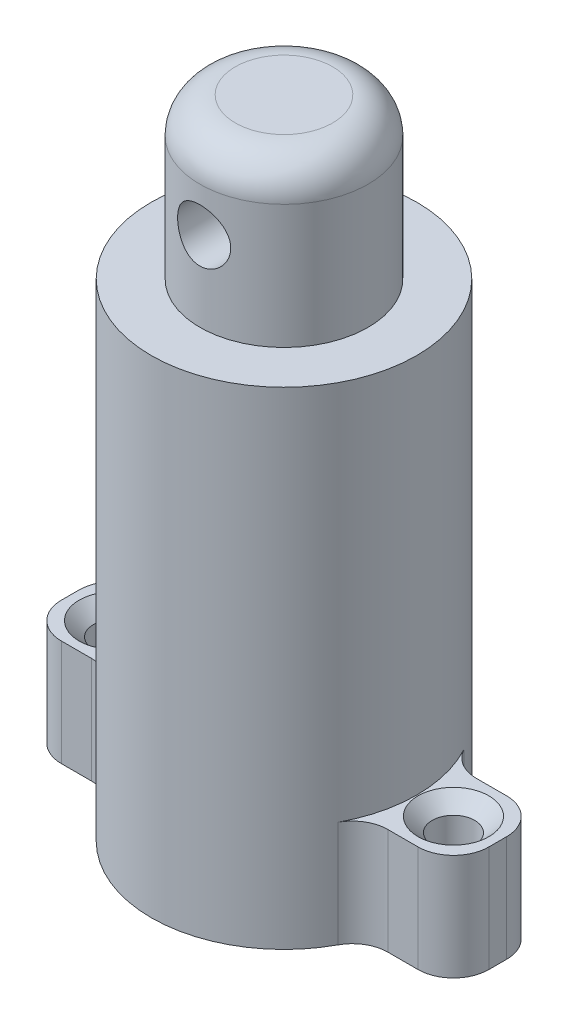
ISO-10303-21;
HEADER;
FILE_DESCRIPTION(('STEP AP214'),'2;1');
FILE_NAME('part.step','',(''),(''),'','','');
FILE_SCHEMA(('AUTOMOTIVE_DESIGN { 1 0 10303 214 1 1 1 1 }'));
ENDSEC;
DATA;
#1=APPLICATION_CONTEXT('core data for automotive mechanical design processes');
#2=APPLICATION_PROTOCOL_DEFINITION('international standard','automotive_design',2000,#1);
#3=PRODUCT_CONTEXT('',#1,'mechanical');
#4=PRODUCT('Part','Part','',(#3));
#5=PRODUCT_RELATED_PRODUCT_CATEGORY('part','',(#4));
#6=PRODUCT_DEFINITION_FORMATION('','',#4);
#7=PRODUCT_DEFINITION_CONTEXT('part definition',#1,'design');
#8=PRODUCT_DEFINITION('design','',#6,#7);
#9=PRODUCT_DEFINITION_SHAPE('','',#8);
#10=(LENGTH_UNIT() NAMED_UNIT(*) SI_UNIT(.MILLI.,.METRE.));
#11=(NAMED_UNIT(*) PLANE_ANGLE_UNIT() SI_UNIT($,.RADIAN.));
#12=(NAMED_UNIT(*) SI_UNIT($,.STERADIAN.) SOLID_ANGLE_UNIT());
#13=UNCERTAINTY_MEASURE_WITH_UNIT(LENGTH_MEASURE(1.E-05),#10,'distance_accuracy_value','');
#14=(GEOMETRIC_REPRESENTATION_CONTEXT(3) GLOBAL_UNCERTAINTY_ASSIGNED_CONTEXT((#13)) GLOBAL_UNIT_ASSIGNED_CONTEXT((#10,
#11,#12)) REPRESENTATION_CONTEXT('',''));
#15=CARTESIAN_POINT('',(0.,0.,0.));
#16=DIRECTION('',(0.,0.,1.));
#17=DIRECTION('',(1.,0.,0.));
#18=AXIS2_PLACEMENT_3D('',#15,#16,#17);
#19=CARTESIAN_POINT('',(-105.,-90.,-15.));
#20=DIRECTION('',(0.,1.,0.));
#21=DIRECTION('',(0.,0.,1.));
#22=AXIS2_PLACEMENT_3D('',#19,#20,#21);
#23=CYLINDRICAL_SURFACE('',#22,15.);
#24=CARTESIAN_POINT('',(-105.,-35.,-15.));
#25=DIRECTION('',(0.,-1.,0.));
#26=DIRECTION('',(0.,0.,-1.));
#27=AXIS2_PLACEMENT_3D('',#24,#25,#26);
#28=CIRCLE('',#27,15.);
#29=CARTESIAN_POINT('',(-105.,-35.,-30.));
#30=VERTEX_POINT('',#29);
#31=EDGE_CURVE('E219',#30,#30,#28,.T.);
#32=ORIENTED_EDGE('',*,*,#31,.T.);
#33=EDGE_LOOP('',(#32));
#34=FACE_BOUND('',#33,.T.);
#35=CARTESIAN_POINT('',(-105.,-78.,-15.));
#36=DIRECTION('',(0.,-1.,0.));
#37=DIRECTION('',(0.,0.,-1.));
#38=AXIS2_PLACEMENT_3D('',#35,#36,#37);
#39=CIRCLE('',#38,15.);
#40=CARTESIAN_POINT('',(-91.7895785284093,-78.,-22.1052631578947));
#41=VERTEX_POINT('',#40);
#42=CARTESIAN_POINT('',(-91.7895785284093,-78.,-7.89473684210526));
#43=VERTEX_POINT('',#42);
#44=EDGE_CURVE('E278',#41,#43,#39,.T.);
#45=ORIENTED_EDGE('',*,*,#44,.F.);
#46=DIRECTION('',(0.,1.,0.));
#47=VECTOR('',#46,1.);
#48=CARTESIAN_POINT('',(-91.7895785284093,-90.,-22.1052631578947));
#49=LINE('',#48,#47);
#50=CARTESIAN_POINT('',(-91.7895785284093,-90.,-22.1052631578947));
#51=VERTEX_POINT('',#50);
#52=EDGE_CURVE('E282',#41,#51,#49,.F.);
#53=ORIENTED_EDGE('',*,*,#52,.T.);
#54=CARTESIAN_POINT('',(-105.,-90.,-15.));
#55=DIRECTION('',(0.,-1.,0.));
#56=DIRECTION('',(0.,0.,-1.));
#57=AXIS2_PLACEMENT_3D('',#54,#55,#56);
#58=CIRCLE('',#57,15.);
#59=CARTESIAN_POINT('',(-118.210421471591,-90.,-22.1052631578947));
#60=VERTEX_POINT('',#59);
#61=EDGE_CURVE('E224',#60,#51,#58,.T.);
#62=ORIENTED_EDGE('',*,*,#61,.F.);
#63=DIRECTION('',(0.,1.,0.));
#64=VECTOR('',#63,1.);
#65=CARTESIAN_POINT('',(-118.210421471591,-90.,-22.1052631578947));
#66=LINE('',#65,#64);
#67=CARTESIAN_POINT('',(-118.210421471591,-78.,-22.1052631578947));
#68=VERTEX_POINT('',#67);
#69=EDGE_CURVE('E297',#60,#68,#66,.T.);
#70=ORIENTED_EDGE('',*,*,#69,.T.);
#71=CARTESIAN_POINT('',(-105.,-78.,-15.));
#72=DIRECTION('',(0.,-1.,0.));
#73=DIRECTION('',(0.,0.,-1.));
#74=AXIS2_PLACEMENT_3D('',#71,#72,#73);
#75=CIRCLE('',#74,15.);
#76=CARTESIAN_POINT('',(-118.210421471591,-78.,-7.89473684210526));
#77=VERTEX_POINT('',#76);
#78=EDGE_CURVE('E203',#77,#68,#75,.T.);
#79=ORIENTED_EDGE('',*,*,#78,.F.);
#80=DIRECTION('',(0.,1.,0.));
#81=VECTOR('',#80,1.);
#82=CARTESIAN_POINT('',(-118.210421471591,-90.,-7.89473684210526));
#83=LINE('',#82,#81);
#84=CARTESIAN_POINT('',(-118.210421471591,-90.,-7.89473684210526));
#85=VERTEX_POINT('',#84);
#86=EDGE_CURVE('E302',#77,#85,#83,.F.);
#87=ORIENTED_EDGE('',*,*,#86,.T.);
#88=CARTESIAN_POINT('',(-91.7895785284093,-90.,-7.89473684210526));
#89=VERTEX_POINT('',#88);
#90=EDGE_CURVE('E221',#89,#85,#58,.T.);
#91=ORIENTED_EDGE('',*,*,#90,.F.);
#92=DIRECTION('',(0.,1.,0.));
#93=VECTOR('',#92,1.);
#94=CARTESIAN_POINT('',(-91.7895785284093,-90.,-7.89473684210526));
#95=LINE('',#94,#93);
#96=EDGE_CURVE('E285',#89,#43,#95,.T.);
#97=ORIENTED_EDGE('',*,*,#96,.T.);
#98=EDGE_LOOP('',(#45,#53,#62,#70,#79,#87,#91,#97));
#99=FACE_BOUND('',#98,.T.);
#100=ADVANCED_FACE('F43',(#34,#99),#23,.T.);
#101=CARTESIAN_POINT('',(-105.,-90.,-15.));
#102=DIRECTION('',(0.,-1.,0.));
#103=DIRECTION('',(0.,0.,-1.));
#104=AXIS2_PLACEMENT_3D('',#101,#102,#103);
#105=PLANE('',#104);
#106=CARTESIAN_POINT('',(-124.142135623731,-90.,-15.));
#107=DIRECTION('',(0.,1.,0.));
#108=DIRECTION('',(0.,0.,1.));
#109=AXIS2_PLACEMENT_3D('',#106,#107,#108);
#110=CIRCLE('',#109,2.4);
#111=CARTESIAN_POINT('',(-124.142135623731,-90.,-12.6));
#112=VERTEX_POINT('',#111);
#113=EDGE_CURVE('E416',#112,#112,#110,.T.);
#114=ORIENTED_EDGE('',*,*,#113,.T.);
#115=EDGE_LOOP('',(#114));
#116=FACE_BOUND('',#115,.T.);
#117=CARTESIAN_POINT('',(-85.857864376269,-90.,-15.));
#118=DIRECTION('',(0.,1.,0.));
#119=DIRECTION('',(0.,0.,1.));
#120=AXIS2_PLACEMENT_3D('',#117,#118,#119);
#121=CIRCLE('',#120,2.4);
#122=CARTESIAN_POINT('',(-85.857864376269,-90.,-12.6));
#123=VERTEX_POINT('',#122);
#124=EDGE_CURVE('E404',#123,#123,#121,.T.);
#125=ORIENTED_EDGE('',*,*,#124,.T.);
#126=EDGE_LOOP('',(#125));
#127=FACE_BOUND('',#126,.T.);
#128=DIRECTION('',(-1.,0.,0.));
#129=VECTOR('',#128,1.);
#130=CARTESIAN_POINT('',(-120.,-90.,-20.));
#131=LINE('',#130,#129);
#132=CARTESIAN_POINT('',(-84.857864376269,-90.,-20.));
#133=VERTEX_POINT('',#132);
#134=CARTESIAN_POINT('',(-88.2667994693185,-90.,-20.));
#135=VERTEX_POINT('',#134);
#136=EDGE_CURVE('E174',#133,#135,#131,.T.);
#137=ORIENTED_EDGE('',*,*,#136,.F.);
#138=CARTESIAN_POINT('',(-84.857864376269,-90.,-16.));
#139=DIRECTION('',(0.,-1.,0.));
#140=DIRECTION('',(0.,0.,-1.));
#141=AXIS2_PLACEMENT_3D('',#138,#139,#140);
#142=CIRCLE('',#141,4.);
#143=CARTESIAN_POINT('',(-80.857864376269,-90.,-16.));
#144=VERTEX_POINT('',#143);
#145=EDGE_CURVE('E157',#133,#144,#142,.T.);
#146=ORIENTED_EDGE('',*,*,#145,.T.);
#147=DIRECTION('',(0.,0.,-1.));
#148=VECTOR('',#147,1.);
#149=CARTESIAN_POINT('',(-80.857864376269,-90.,0.));
#150=LINE('',#149,#148);
#151=CARTESIAN_POINT('',(-80.857864376269,-90.,-14.));
#152=VERTEX_POINT('',#151);
#153=EDGE_CURVE('E192',#152,#144,#150,.T.);
#154=ORIENTED_EDGE('',*,*,#153,.F.);
#155=CARTESIAN_POINT('',(-84.857864376269,-90.,-14.));
#156=DIRECTION('',(0.,-1.,0.));
#157=DIRECTION('',(0.,0.,-1.));
#158=AXIS2_PLACEMENT_3D('',#155,#156,#157);
#159=CIRCLE('',#158,4.);
#160=CARTESIAN_POINT('',(-84.857864376269,-90.,-10.));
#161=VERTEX_POINT('',#160);
#162=EDGE_CURVE('E178',#152,#161,#159,.T.);
#163=ORIENTED_EDGE('',*,*,#162,.T.);
#164=DIRECTION('',(1.,0.,0.));
#165=VECTOR('',#164,1.);
#166=CARTESIAN_POINT('',(-120.,-90.,-10.));
#167=LINE('',#166,#165);
#168=CARTESIAN_POINT('',(-88.2667994693185,-90.,-10.));
#169=VERTEX_POINT('',#168);
#170=EDGE_CURVE('E186',#169,#161,#167,.T.);
#171=ORIENTED_EDGE('',*,*,#170,.F.);
#172=CARTESIAN_POINT('',(-88.2667994693185,-90.,-6.));
#173=DIRECTION('',(0.,-1.,0.));
#174=DIRECTION('',(0.,0.,-1.));
#175=AXIS2_PLACEMENT_3D('',#172,#173,#174);
#176=CIRCLE('',#175,4.);
#177=EDGE_CURVE('E51',#169,#89,#176,.F.);
#178=ORIENTED_EDGE('',*,*,#177,.T.);
#179=ORIENTED_EDGE('',*,*,#90,.T.);
#180=CARTESIAN_POINT('',(-121.733200530682,-90.,-6.));
#181=DIRECTION('',(0.,-1.,0.));
#182=DIRECTION('',(0.,0.,-1.));
#183=AXIS2_PLACEMENT_3D('',#180,#181,#182);
#184=CIRCLE('',#183,4.);
#185=CARTESIAN_POINT('',(-121.733200530682,-90.,-10.));
#186=VERTEX_POINT('',#185);
#187=EDGE_CURVE('E329',#85,#186,#184,.F.);
#188=ORIENTED_EDGE('',*,*,#187,.T.);
#189=DIRECTION('',(-1.,0.,0.));
#190=VECTOR('',#189,1.);
#191=CARTESIAN_POINT('',(-120.,-90.,-10.));
#192=LINE('',#191,#190);
#193=CARTESIAN_POINT('',(-125.142135623731,-90.,-10.));
#194=VERTEX_POINT('',#193);
#195=EDGE_CURVE('E200',#186,#194,#192,.T.);
#196=ORIENTED_EDGE('',*,*,#195,.T.);
#197=CARTESIAN_POINT('',(-125.142135623731,-90.,-14.));
#198=DIRECTION('',(0.,-1.,0.));
#199=DIRECTION('',(0.,0.,-1.));
#200=AXIS2_PLACEMENT_3D('',#197,#198,#199);
#201=CIRCLE('',#200,4.);
#202=CARTESIAN_POINT('',(-129.142135623731,-90.,-14.));
#203=VERTEX_POINT('',#202);
#204=EDGE_CURVE('E348',#194,#203,#201,.T.);
#205=ORIENTED_EDGE('',*,*,#204,.T.);
#206=DIRECTION('',(0.,0.,-1.));
#207=VECTOR('',#206,1.);
#208=CARTESIAN_POINT('',(-129.142135623731,-90.,0.));
#209=LINE('',#208,#207);
#210=CARTESIAN_POINT('',(-129.142135623731,-90.,-16.));
#211=VERTEX_POINT('',#210);
#212=EDGE_CURVE('E208',#203,#211,#209,.T.);
#213=ORIENTED_EDGE('',*,*,#212,.T.);
#214=CARTESIAN_POINT('',(-125.142135623731,-90.,-16.));
#215=DIRECTION('',(0.,-1.,0.));
#216=DIRECTION('',(0.,0.,-1.));
#217=AXIS2_PLACEMENT_3D('',#214,#215,#216);
#218=CIRCLE('',#217,4.);
#219=CARTESIAN_POINT('',(-125.142135623731,-90.,-20.));
#220=VERTEX_POINT('',#219);
#221=EDGE_CURVE('E168',#211,#220,#218,.T.);
#222=ORIENTED_EDGE('',*,*,#221,.T.);
#223=DIRECTION('',(1.,0.,0.));
#224=VECTOR('',#223,1.);
#225=CARTESIAN_POINT('',(-120.,-90.,-20.));
#226=LINE('',#225,#224);
#227=CARTESIAN_POINT('',(-121.733200530682,-90.,-20.));
#228=VERTEX_POINT('',#227);
#229=EDGE_CURVE('E211',#220,#228,#226,.T.);
#230=ORIENTED_EDGE('',*,*,#229,.T.);
#231=CARTESIAN_POINT('',(-121.733200530682,-90.,-24.));
#232=DIRECTION('',(0.,-1.,0.));
#233=DIRECTION('',(0.,0.,-1.));
#234=AXIS2_PLACEMENT_3D('',#231,#232,#233);
#235=CIRCLE('',#234,4.);
#236=EDGE_CURVE('E293',#228,#60,#235,.F.);
#237=ORIENTED_EDGE('',*,*,#236,.T.);
#238=ORIENTED_EDGE('',*,*,#61,.T.);
#239=CARTESIAN_POINT('',(-88.2667994693185,-90.,-24.));
#240=DIRECTION('',(0.,-1.,0.));
#241=DIRECTION('',(0.,0.,-1.));
#242=AXIS2_PLACEMENT_3D('',#239,#240,#241);
#243=CIRCLE('',#242,4.);
#244=EDGE_CURVE('E184',#51,#135,#243,.F.);
#245=ORIENTED_EDGE('',*,*,#244,.T.);
#246=EDGE_LOOP('',(#137,#146,#154,#163,#171,#178,#179,#188,#196,#205,#213,#222,#230,#237,#238,#245));
#247=FACE_BOUND('',#246,.T.);
#248=CARTESIAN_POINT('',(-105.,-90.,-15.));
#249=DIRECTION('',(0.,-1.,0.));
#250=DIRECTION('',(0.,0.,-1.));
#251=AXIS2_PLACEMENT_3D('',#248,#249,#250);
#252=CIRCLE('',#251,10.);
#253=CARTESIAN_POINT('',(-105.,-90.,-25.));
#254=VERTEX_POINT('',#253);
#255=EDGE_CURVE('E216',#254,#254,#252,.T.);
#256=ORIENTED_EDGE('',*,*,#255,.F.);
#257=EDGE_LOOP('',(#256));
#258=FACE_BOUND('',#257,.T.);
#259=ADVANCED_FACE('F181',(#116,#127,#247,#258),#105,.T.);
#260=CARTESIAN_POINT('',(-105.,-35.,-15.));
#261=DIRECTION('',(0.,-1.,0.));
#262=DIRECTION('',(0.,0.,-1.));
#263=AXIS2_PLACEMENT_3D('',#260,#261,#262);
#264=PLANE('',#263);
#265=CARTESIAN_POINT('',(-105.,-35.,-15.));
#266=DIRECTION('',(0.,-1.,0.));
#267=DIRECTION('',(0.,0.,-1.));
#268=AXIS2_PLACEMENT_3D('',#265,#266,#267);
#269=CIRCLE('',#268,9.5);
#270=CARTESIAN_POINT('',(-105.,-35.,-24.5));
#271=VERTEX_POINT('',#270);
#272=EDGE_CURVE('E227',#271,#271,#269,.F.);
#273=ORIENTED_EDGE('',*,*,#272,.F.);
#274=EDGE_LOOP('',(#273));
#275=FACE_BOUND('',#274,.T.);
#276=ORIENTED_EDGE('',*,*,#31,.F.);
#277=EDGE_LOOP('',(#276));
#278=FACE_BOUND('',#277,.T.);
#279=ADVANCED_FACE('F263',(#275,#278),#264,.F.);
#280=CARTESIAN_POINT('',(-105.,-90.,-15.));
#281=DIRECTION('',(0.,1.,0.));
#282=DIRECTION('',(0.,0.,1.));
#283=AXIS2_PLACEMENT_3D('',#280,#281,#282);
#284=CYLINDRICAL_SURFACE('',#283,10.);
#285=CARTESIAN_POINT('',(-105.,-55.,-15.));
#286=DIRECTION('',(0.,1.,0.));
#287=DIRECTION('',(0.,0.,1.));
#288=AXIS2_PLACEMENT_3D('',#285,#286,#287);
#289=CIRCLE('',#288,10.);
#290=CARTESIAN_POINT('',(-105.,-55.,-5.));
#291=VERTEX_POINT('',#290);
#292=EDGE_CURVE('E352',#291,#291,#289,.T.);
#293=ORIENTED_EDGE('',*,*,#292,.T.);
#294=EDGE_LOOP('',(#293));
#295=FACE_BOUND('',#294,.T.);
#296=ORIENTED_EDGE('',*,*,#255,.T.);
#297=EDGE_LOOP('',(#296));
#298=FACE_BOUND('',#297,.T.);
#299=ADVANCED_FACE('F260',(#295,#298),#284,.F.);
#300=CARTESIAN_POINT('',(-105.,-17.,-15.));
#301=DIRECTION('',(0.,-1.,0.));
#302=DIRECTION('',(0.,0.,-1.));
#303=AXIS2_PLACEMENT_3D('',#300,#301,#302);
#304=CYLINDRICAL_SURFACE('',#303,9.5);
#305=CARTESIAN_POINT('',(-105.,-21.,-15.));
#306=DIRECTION('',(0.,-1.,0.));
#307=DIRECTION('',(0.,0.,-1.));
#308=AXIS2_PLACEMENT_3D('',#305,#306,#307);
#309=CIRCLE('',#308,9.5);
#310=CARTESIAN_POINT('',(-105.,-21.,-24.5));
#311=VERTEX_POINT('',#310);
#312=EDGE_CURVE('E355',#311,#311,#309,.T.);
#313=ORIENTED_EDGE('',*,*,#312,.T.);
#314=EDGE_LOOP('',(#313));
#315=FACE_BOUND('',#314,.T.);
#316=CARTESIAN_POINT('',(-105.,-23.,-24.5));
#317=CARTESIAN_POINT('',(-105.164167089463,-23.0000008079942,-24.4999993580923));
#318=CARTESIAN_POINT('',(-105.328342993004,-23.0135197389892,-24.4957045787345));
#319=CARTESIAN_POINT('',(-105.651888233263,-23.0670928984464,-24.4789929618289));
#320=CARTESIAN_POINT('',(-105.811256566918,-23.1071526249545,-24.4665744414181));
#321=CARTESIAN_POINT('',(-106.120474539009,-23.212317912368,-24.4349708637405));
#322=CARTESIAN_POINT('',(-106.270338668182,-23.2773842222139,-24.4157964146812));
#323=CARTESIAN_POINT('',(-106.557029158414,-23.4305470728574,-24.3726572519913));
#324=CARTESIAN_POINT('',(-106.693853376786,-23.5186473896769,-24.3486917531037));
#325=CARTESIAN_POINT('',(-106.954886157509,-23.7182946748529,-24.2976675332429));
#326=CARTESIAN_POINT('',(-107.078626931778,-23.8304356974736,-24.2705403669451));
#327=CARTESIAN_POINT('',(-107.305894852278,-24.0737165602455,-24.2166435380355));
#328=CARTESIAN_POINT('',(-107.4094181339,-24.2048600244188,-24.1898739446838));
#329=CARTESIAN_POINT('',(-107.595869337072,-24.4864975642318,-24.1389859370637));
#330=CARTESIAN_POINT('',(-107.678209240383,-24.6373976068883,-24.1149518397918));
#331=CARTESIAN_POINT('',(-107.816147786545,-24.9517849235525,-24.0732872417104));
#332=CARTESIAN_POINT('',(-107.871753643356,-25.1152687880907,-24.0556550137243));
#333=CARTESIAN_POINT('',(-107.952927282126,-25.4448978047389,-24.0295072122738));
#334=CARTESIAN_POINT('',(-107.979364205487,-25.6108074688176,-24.020728562665));
#335=CARTESIAN_POINT('',(-108.00416514792,-25.9449217964397,-24.0125012220487));
#336=CARTESIAN_POINT('',(-108.002536812104,-26.1131258225131,-24.0130499902065));
#337=CARTESIAN_POINT('',(-107.971932476094,-26.4398310376778,-24.0231835227404));
#338=CARTESIAN_POINT('',(-107.944065762482,-26.5984494324817,-24.0324017479326));
#339=CARTESIAN_POINT('',(-107.863575960112,-26.9086330548852,-24.0582394148415));
#340=CARTESIAN_POINT('',(-107.81095018946,-27.0601975164501,-24.0748596583322));
#341=CARTESIAN_POINT('',(-107.681661681692,-27.3545945357513,-24.1139065191807));
#342=CARTESIAN_POINT('',(-107.604653677163,-27.4972640463096,-24.1364156779989));
#343=CARTESIAN_POINT('',(-107.429026433832,-27.7680176486991,-24.1846668373259));
#344=CARTESIAN_POINT('',(-107.330401481839,-27.896097871069,-24.2104096917062));
#345=CARTESIAN_POINT('',(-107.108914435261,-28.140302722997,-24.2636937640577));
#346=CARTESIAN_POINT('',(-106.985137923183,-28.2555934581482,-24.2912629180017));
#347=CARTESIAN_POINT('',(-106.719665067862,-28.4639864805402,-24.3440378521759));
#348=CARTESIAN_POINT('',(-106.577967341579,-28.5570870536888,-24.3692434497406));
#349=CARTESIAN_POINT('',(-106.279042488608,-28.7190380889495,-24.4147256677174));
#350=CARTESIAN_POINT('',(-106.121698806459,-28.7876858920488,-24.4349606838189));
#351=CARTESIAN_POINT('',(-105.79690854605,-28.8972895556039,-24.4679212621274));
#352=CARTESIAN_POINT('',(-105.629465120717,-28.9382540099795,-24.4806491546628));
#353=CARTESIAN_POINT('',(-105.296303884002,-28.9898989182783,-24.4967847077904));
#354=CARTESIAN_POINT('',(-105.130777575906,-29.0017079316047,-24.5005395079635));
#355=CARTESIAN_POINT('',(-104.800088621039,-28.9978937651673,-24.4993347158578));
#356=CARTESIAN_POINT('',(-104.634925923591,-28.982274687076,-24.4943764265584));
#357=CARTESIAN_POINT('',(-104.314030787096,-28.9249518202319,-24.4765308692281));
#358=CARTESIAN_POINT('',(-104.158165293439,-28.8839228174412,-24.4638488528251));
#359=CARTESIAN_POINT('',(-103.855576856497,-28.7777712537272,-24.4320443454722));
#360=CARTESIAN_POINT('',(-103.708855051928,-28.7126456989056,-24.4129210542468));
#361=CARTESIAN_POINT('',(-103.424687237553,-28.5583538198726,-24.3696089503132));
#362=CARTESIAN_POINT('',(-103.287559802009,-28.4686334858539,-24.3453066989661));
#363=CARTESIAN_POINT('',(-103.029930203491,-28.2683613577479,-24.2944121872772));
#364=CARTESIAN_POINT('',(-102.909432655685,-28.1578038009185,-24.2678192945428));
#365=CARTESIAN_POINT('',(-102.683413244201,-27.9136868065147,-24.2139829863384));
#366=CARTESIAN_POINT('',(-102.578695992651,-27.7793768788571,-24.186756871098));
#367=CARTESIAN_POINT('',(-102.393209866726,-27.4944999229132,-24.1358594627064));
#368=CARTESIAN_POINT('',(-102.312440688919,-27.3439331006408,-24.1121881245168));
#369=CARTESIAN_POINT('',(-102.177629024826,-27.0310761022387,-24.0713392581632));
#370=CARTESIAN_POINT('',(-102.12348960594,-26.8688309461515,-24.0541382326222));
#371=CARTESIAN_POINT('',(-102.043500558192,-26.5368703997547,-24.0283393693878));
#372=CARTESIAN_POINT('',(-102.017639868443,-26.3671579572238,-24.0197381680889));
#373=CARTESIAN_POINT('',(-101.995747587885,-26.0335061481396,-24.0124683357529));
#374=CARTESIAN_POINT('',(-101.998393718307,-25.8696620800031,-24.0133593876891));
#375=CARTESIAN_POINT('',(-102.030238336098,-25.5448766842275,-24.0239010711208));
#376=CARTESIAN_POINT('',(-102.059435535222,-25.3839352161418,-24.0335512776259));
#377=CARTESIAN_POINT('',(-102.142660201421,-25.071943058435,-24.0602130487632));
#378=CARTESIAN_POINT('',(-102.196301653754,-24.9207788544233,-24.0771099408374));
#379=CARTESIAN_POINT('',(-102.326586993687,-24.6294760084224,-24.1163298449927));
#380=CARTESIAN_POINT('',(-102.403235630656,-24.4893396504551,-24.1386539772368));
#381=CARTESIAN_POINT('',(-102.580929197391,-24.218026509405,-24.1873223558432));
#382=CARTESIAN_POINT('',(-102.682824307421,-24.0874289834632,-24.2137913167149));
#383=CARTESIAN_POINT('',(-102.906631518692,-23.8447583247386,-24.2672016241294));
#384=CARTESIAN_POINT('',(-103.028549019328,-23.7326902051457,-24.294143096338));
#385=CARTESIAN_POINT('',(-103.293867347152,-23.5264861513898,-24.3465488605791));
#386=CARTESIAN_POINT('',(-103.43785235297,-23.4330792185407,-24.3719331087474));
#387=CARTESIAN_POINT('',(-103.740281054314,-23.271916631258,-24.4173475848601));
#388=CARTESIAN_POINT('',(-103.898719336056,-23.2041514207308,-24.4373798065647));
#389=CARTESIAN_POINT('',(-104.212728170044,-23.1008024617936,-24.468532861615));
#390=CARTESIAN_POINT('',(-104.367549733627,-23.0631122408288,-24.4802292102187));
#391=CARTESIAN_POINT('',(-104.681578728099,-23.0127132746711,-24.4959622761552));
#392=CARTESIAN_POINT('',(-104.840785218888,-22.99999921638,-24.5000006225437));
#393=CARTESIAN_POINT('',(-105.,-23.,-24.5));
#394=B_SPLINE_CURVE_WITH_KNOTS('',3,(#316,#317,#318,#319,#320,#321,#322,#323,#324,#325,#326,
#327,#328,#329,#330,#331,#332,#333,#334,#335,#336,#337,#338,#339,#340,#341,#342,#343,#344,#345,
#346,#347,#348,#349,#350,#351,#352,#353,#354,#355,#356,#357,#358,#359,#360,#361,#362,#363,#364,
#365,#366,#367,#368,#369,#370,#371,#372,#373,#374,#375,#376,#377,#378,#379,#380,#381,#382,#383,
#384,#385,#386,#387,#388,#389,#390,#391,#392,#393),.UNSPECIFIED.,.T.,.F.,(4,2,2,2,2,2,2,2,2,2,2,
2,2,2,2,2,2,2,2,2,2,2,2,2,2,2,2,2,2,2,2,2,2,2,2,2,2,2,4),(0.,0.491915941705377,
0.983933817902436,1.47518254201798,1.96651184830559,2.47177433217167,2.97713330355078,
3.49529138086523,4.01330955891889,4.51543663249027,5.0174269263623,5.49910423633608,
5.98083373346491,6.46971527661727,6.95872618352225,7.47049694812959,7.98230723196765,
8.49826565849843,9.01406383907481,9.50955937080913,10.0049808110835,10.4877787812059,
10.9706367571643,11.4654198237929,11.9603399289468,12.4753133176054,12.9902801810781,
13.5033584262729,14.0162359151874,14.5054301927743,14.9946007361353,15.4763007218674,
15.9581002132873,16.4590917155025,16.9602185415511,17.4781824310863,17.9959530965539,
18.4731312898966,18.9502079636715),.UNSPECIFIED.);
#395=CARTESIAN_POINT('',(-105.,-23.,-24.5));
#396=VERTEX_POINT('',#395);
#397=EDGE_CURVE('E220',#396,#396,#394,.T.);
#398=ORIENTED_EDGE('',*,*,#397,.T.);
#399=EDGE_LOOP('',(#398));
#400=FACE_BOUND('',#399,.T.);
#401=CARTESIAN_POINT('',(-108.,-26.,-5.98612181134002));
#402=CARTESIAN_POINT('',(-107.99999916009,-25.8360634346477,-5.98612100969062));
#403=CARTESIAN_POINT('',(-107.986516804634,-25.6721180325505,-5.9816005825183));
#404=CARTESIAN_POINT('',(-107.933102097742,-25.3490499810011,-5.96408934924379));
#405=CARTESIAN_POINT('',(-107.893163042625,-25.1899285645546,-5.95109639635945));
#406=CARTESIAN_POINT('',(-107.788350167052,-24.8812355943009,-5.91825530425475));
#407=CARTESIAN_POINT('',(-107.723521190748,-24.731647426377,-5.89841950027868));
#408=CARTESIAN_POINT('',(-107.570918933045,-24.4454278879907,-5.85414496011506));
#409=CARTESIAN_POINT('',(-107.483141436702,-24.3087989040241,-5.82970537858473));
#410=CARTESIAN_POINT('',(-107.283835699426,-24.0475826570959,-5.77801532395759));
#411=CARTESIAN_POINT('',(-107.171640609875,-23.9235168725282,-5.75070015534826));
#412=CARTESIAN_POINT('',(-106.928110843954,-23.695611294353,-5.69688657813697));
#413=CARTESIAN_POINT('',(-106.796773440468,-23.5917743875927,-5.67038828656444));
#414=CARTESIAN_POINT('',(-106.514929673403,-23.4049629877492,-5.62045268168193));
#415=CARTESIAN_POINT('',(-106.364050002112,-23.3225269765933,-5.59710040908694));
#416=CARTESIAN_POINT('',(-106.049704134847,-23.1844054855509,-5.55684453967551));
#417=CARTESIAN_POINT('',(-105.886240974442,-23.1287135773877,-5.53993939341363));
#418=CARTESIAN_POINT('',(-105.556829551654,-23.0474065377978,-5.51494050299839));
#419=CARTESIAN_POINT('',(-105.391121502287,-23.0208997970879,-5.50658613384737));
#420=CARTESIAN_POINT('',(-105.057413457221,-22.9958889918049,-5.49870890919401));
#421=CARTESIAN_POINT('',(-104.889414002261,-22.9973784309799,-5.49918400489659));
#422=CARTESIAN_POINT('',(-104.562172761296,-23.0277343991118,-5.50873145299671));
#423=CARTESIAN_POINT('',(-104.40283101004,-23.0556340994337,-5.51750018201622));
#424=CARTESIAN_POINT('',(-104.09121937649,-23.1364303153009,-5.54227501027744));
#425=CARTESIAN_POINT('',(-103.938949959328,-23.1893284723902,-5.55828158479518));
#426=CARTESIAN_POINT('',(-103.64359269465,-23.3192323637695,-5.59613792880366));
#427=CARTESIAN_POINT('',(-103.500641973409,-23.3965286553513,-5.61805763467375));
#428=CARTESIAN_POINT('',(-103.229441795242,-23.572800629175,-5.66543500265061));
#429=CARTESIAN_POINT('',(-103.101196128531,-23.6717818816471,-5.6908935731726));
#430=CARTESIAN_POINT('',(-102.857283251183,-23.8935639324672,-5.74392020548476));
#431=CARTESIAN_POINT('',(-102.742382560509,-24.017198468095,-5.77153193542966));
#432=CARTESIAN_POINT('',(-102.5347139789,-24.2822363179685,-5.82482215104662));
#433=CARTESIAN_POINT('',(-102.441948811138,-24.4236418151832,-5.85050039859065));
#434=CARTESIAN_POINT('',(-102.280267226175,-24.7224135436321,-5.89723951920617));
#435=CARTESIAN_POINT('',(-102.211640727276,-24.8799462771047,-5.91824321700665));
#436=CARTESIAN_POINT('',(-102.102133151021,-25.205156203299,-5.9525860224881));
#437=CARTESIAN_POINT('',(-102.061241853934,-25.3728296345934,-5.96592795306197));
#438=CARTESIAN_POINT('',(-102.009856760402,-25.7062047206758,-5.98280812376431));
#439=CARTESIAN_POINT('',(-101.998186894225,-25.871706007365,-5.98672540771475));
#440=CARTESIAN_POINT('',(-102.002269720694,-26.2023154319255,-5.9853662507911));
#441=CARTESIAN_POINT('',(-102.018018065587,-26.3674236279726,-5.98009126755114));
#442=CARTESIAN_POINT('',(-102.075438308034,-26.6874533757969,-5.96131673350252));
#443=CARTESIAN_POINT('',(-102.116325616174,-26.8425318413344,-5.94806634963258));
#444=CARTESIAN_POINT('',(-102.221938866273,-27.1436078649571,-5.91509955632878));
#445=CARTESIAN_POINT('',(-102.286668750247,-27.2896039167323,-5.89538207771642));
#446=CARTESIAN_POINT('',(-102.440282517315,-27.5730834074432,-5.85098921666342));
#447=CARTESIAN_POINT('',(-102.529815715712,-27.7101944565478,-5.82618602298235));
#448=CARTESIAN_POINT('',(-102.72974002634,-27.9678740915171,-5.77467844762972));
#449=CARTESIAN_POINT('',(-102.840136670721,-28.0884382751468,-5.74797356287908));
#450=CARTESIAN_POINT('',(-103.084227924938,-28.314883553216,-5.69429973089647));
#451=CARTESIAN_POINT('',(-103.21871266978,-28.4199239657768,-5.66736770675384));
#452=CARTESIAN_POINT('',(-103.504053278739,-28.6059826163827,-5.61740488406344));
#453=CARTESIAN_POINT('',(-103.65490841364,-28.687001923841,-5.59437391186143));
#454=CARTESIAN_POINT('',(-103.967801423098,-28.8219447250633,-5.55493662583654));
#455=CARTESIAN_POINT('',(-104.129749437134,-28.876062063569,-5.53848309128134));
#456=CARTESIAN_POINT('',(-104.461061201016,-28.956106088686,-5.5138472531998));
#457=CARTESIAN_POINT('',(-104.630422557995,-28.9820418029305,-5.50566230099488));
#458=CARTESIAN_POINT('',(-104.964022702824,-29.0042406065317,-5.4986651365482));
#459=CARTESIAN_POINT('',(-105.128173672308,-29.00171680543,-5.49946972408845));
#460=CARTESIAN_POINT('',(-105.453606441926,-28.9700109093279,-5.50943941994109));
#461=CARTESIAN_POINT('',(-105.614888435162,-28.9408306154566,-5.51860396338689));
#462=CARTESIAN_POINT('',(-105.927939673529,-28.8574178801142,-5.54413950591636));
#463=CARTESIAN_POINT('',(-106.079805345549,-28.8035161345048,-5.56041524732704));
#464=CARTESIAN_POINT('',(-106.372408690366,-28.6724902868108,-5.59849544407887));
#465=CARTESIAN_POINT('',(-106.513144430226,-28.5953621621283,-5.62030085700552));
#466=CARTESIAN_POINT('',(-106.784764313428,-28.417005361053,-5.66810325274972));
#467=CARTESIAN_POINT('',(-106.915142772534,-28.3150386571887,-5.69421865611733));
#468=CARTESIAN_POINT('',(-107.157340195279,-28.0911935750031,-5.74736324062632));
#469=CARTESIAN_POINT('',(-107.269153528506,-27.9693091782212,-5.77439269599975));
#470=CARTESIAN_POINT('',(-107.474892247443,-27.7041171144557,-5.82739967867121));
#471=CARTESIAN_POINT('',(-107.568079116472,-27.5602214034839,-5.85331007300479));
#472=CARTESIAN_POINT('',(-107.728851216987,-27.2580278865587,-5.89997709807926));
#473=CARTESIAN_POINT('',(-107.79644626098,-27.09973562951,-5.92073570308319));
#474=CARTESIAN_POINT('',(-107.899498010071,-26.7861070948575,-5.95314400234149));
#475=CARTESIAN_POINT('',(-107.937073641396,-26.6315271082842,-5.96538425082366));
#476=CARTESIAN_POINT('',(-107.98732180654,-26.3179667482948,-5.98187250515971));
#477=CARTESIAN_POINT('',(-108.000000814554,-26.1589875297766,-5.98612258878865));
#478=CARTESIAN_POINT('',(-108.,-26.,-5.98612181134002));
#479=B_SPLINE_CURVE_WITH_KNOTS('',3,(#401,#402,#403,#404,#405,#406,#407,#408,#409,#410,#411,
#412,#413,#414,#415,#416,#417,#418,#419,#420,#421,#422,#423,#424,#425,#426,#427,#428,#429,#430,
#431,#432,#433,#434,#435,#436,#437,#438,#439,#440,#441,#442,#443,#444,#445,#446,#447,#448,#449,
#450,#451,#452,#453,#454,#455,#456,#457,#458,#459,#460,#461,#462,#463,#464,#465,#466,#467,#468,
#469,#470,#471,#472,#473,#474,#475,#476,#477,#478),.UNSPECIFIED.,.T.,.F.,(4,2,2,2,2,2,2,2,2,2,2,
2,2,2,2,2,2,2,2,2,2,2,2,2,2,2,2,2,2,2,2,2,2,2,2,2,2,2,4),(0.,0.491222181158546,
0.982568877371571,1.47303443769153,1.96359014493515,2.46975467928505,2.97599139514678,
3.49394489794377,4.01177384180478,4.51330187161205,5.0147135279646,5.49845160025534,
5.98222144201366,6.4719848720446,6.96187425574551,7.47259002708078,7.98336859572039,
8.50008771949267,9.016616341505,9.51199573643174,10.007296585316,10.4878728285309,
10.9685285635467,11.4632008063928,11.9580044009777,12.4738149453962,12.9896025226149,
13.501617628388,14.0134686680832,14.5035871064134,14.993672430811,15.4773850040824,
15.9611814002052,16.461626540619,16.9622231793843,17.479861117622,17.9973003798423,
18.4738171219117,18.9502099326676),.UNSPECIFIED.);
#480=CARTESIAN_POINT('',(-108.,-26.,-5.98612181134002));
#481=VERTEX_POINT('',#480);
#482=EDGE_CURVE('E207',#481,#481,#479,.T.);
#483=ORIENTED_EDGE('',*,*,#482,.T.);
#484=EDGE_LOOP('',(#483));
#485=FACE_BOUND('',#484,.T.);
#486=ORIENTED_EDGE('',*,*,#272,.T.);
#487=EDGE_LOOP('',(#486));
#488=FACE_BOUND('',#487,.T.);
#489=ADVANCED_FACE('F242',(#315,#400,#485,#488),#304,.T.);
#490=CARTESIAN_POINT('',(-120.,-17.,0.));
#491=DIRECTION('',(0.,-1.,0.));
#492=DIRECTION('',(0.,0.,-1.));
#493=AXIS2_PLACEMENT_3D('',#490,#491,#492);
#494=PLANE('',#493);
#495=CARTESIAN_POINT('',(-105.,-17.,-15.));
#496=DIRECTION('',(0.,-1.,0.));
#497=DIRECTION('',(0.,0.,-1.));
#498=AXIS2_PLACEMENT_3D('',#495,#496,#497);
#499=CIRCLE('',#498,5.5);
#500=CARTESIAN_POINT('',(-105.,-17.,-20.5));
#501=VERTEX_POINT('',#500);
#502=EDGE_CURVE('E230',#501,#501,#499,.F.);
#503=ORIENTED_EDGE('',*,*,#502,.T.);
#504=EDGE_LOOP('',(#503));
#505=FACE_BOUND('',#504,.T.);
#506=ADVANCED_FACE('F252',(#505),#494,.F.);
#507=CARTESIAN_POINT('',(-105.,-26.,-30.));
#508=DIRECTION('',(0.,0.,-1.));
#509=DIRECTION('',(-1.,0.,0.));
#510=AXIS2_PLACEMENT_3D('',#507,#508,#509);
#511=CYLINDRICAL_SURFACE('',#510,2.99999999999999);
#512=ORIENTED_EDGE('',*,*,#482,.F.);
#513=EDGE_LOOP('',(#512));
#514=FACE_BOUND('',#513,.T.);
#515=ORIENTED_EDGE('',*,*,#397,.F.);
#516=EDGE_LOOP('',(#515));
#517=FACE_BOUND('',#516,.T.);
#518=ADVANCED_FACE('F246',(#514,#517),#511,.F.);
#519=CARTESIAN_POINT('',(-105.,-21.,-15.));
#520=DIRECTION('',(0.,-1.,0.));
#521=DIRECTION('',(0.,0.,-1.));
#522=AXIS2_PLACEMENT_3D('',#519,#520,#521);
#523=TOROIDAL_SURFACE('',#522,5.5,4.);
#524=ORIENTED_EDGE('',*,*,#312,.F.);
#525=EDGE_LOOP('',(#524));
#526=FACE_BOUND('',#525,.T.);
#527=ORIENTED_EDGE('',*,*,#502,.F.);
#528=EDGE_LOOP('',(#527));
#529=FACE_BOUND('',#528,.T.);
#530=ADVANCED_FACE('F251',(#526,#529),#523,.T.);
#531=CARTESIAN_POINT('',(-105.,-55.,-15.));
#532=DIRECTION('',(0.,-1.,0.));
#533=DIRECTION('',(0.,0.,-1.));
#534=AXIS2_PLACEMENT_3D('',#531,#532,#533);
#535=SPHERICAL_SURFACE('',#534,10.);
#536=ORIENTED_EDGE('',*,*,#292,.F.);
#537=EDGE_LOOP('',(#536));
#538=FACE_BOUND('',#537,.T.);
#539=ADVANCED_FACE('F361',(#538),#535,.F.);
#540=CARTESIAN_POINT('',(-129.142135623731,-78.,0.));
#541=DIRECTION('',(-1.,0.,0.));
#542=DIRECTION('',(0.,0.,1.));
#543=AXIS2_PLACEMENT_3D('',#540,#541,#542);
#544=PLANE('',#543);
#545=DIRECTION('',(0.,0.,-1.));
#546=VECTOR('',#545,1.);
#547=CARTESIAN_POINT('',(-129.142135623731,-78.,0.));
#548=LINE('',#547,#546);
#549=CARTESIAN_POINT('',(-129.142135623731,-78.,-14.));
#550=VERTEX_POINT('',#549);
#551=CARTESIAN_POINT('',(-129.142135623731,-78.,-16.));
#552=VERTEX_POINT('',#551);
#553=EDGE_CURVE('E196',#550,#552,#548,.T.);
#554=ORIENTED_EDGE('',*,*,#553,.T.);
#555=DIRECTION('',(0.,-1.,0.));
#556=VECTOR('',#555,1.);
#557=CARTESIAN_POINT('',(-129.142135623731,-78.,-16.));
#558=LINE('',#557,#556);
#559=EDGE_CURVE('E310',#552,#211,#558,.T.);
#560=ORIENTED_EDGE('',*,*,#559,.T.);
#561=ORIENTED_EDGE('',*,*,#212,.F.);
#562=DIRECTION('',(0.,-1.,0.));
#563=VECTOR('',#562,1.);
#564=CARTESIAN_POINT('',(-129.142135623731,-78.,-14.));
#565=LINE('',#564,#563);
#566=EDGE_CURVE('E308',#203,#550,#565,.F.);
#567=ORIENTED_EDGE('',*,*,#566,.T.);
#568=EDGE_LOOP('',(#554,#560,#561,#567));
#569=FACE_BOUND('',#568,.T.);
#570=ADVANCED_FACE('F254',(#569),#544,.T.);
#571=CARTESIAN_POINT('',(-120.,-78.,-10.));
#572=DIRECTION('',(0.,0.,1.));
#573=DIRECTION('',(1.,0.,0.));
#574=AXIS2_PLACEMENT_3D('',#571,#572,#573);
#575=PLANE('',#574);
#576=DIRECTION('',(-1.,0.,0.));
#577=VECTOR('',#576,1.);
#578=CARTESIAN_POINT('',(-120.,-78.,-10.));
#579=LINE('',#578,#577);
#580=CARTESIAN_POINT('',(-121.733200530682,-78.,-10.));
#581=VERTEX_POINT('',#580);
#582=CARTESIAN_POINT('',(-125.142135623731,-78.,-10.));
#583=VERTEX_POINT('',#582);
#584=EDGE_CURVE('E205',#581,#583,#579,.T.);
#585=ORIENTED_EDGE('',*,*,#584,.T.);
#586=DIRECTION('',(0.,-1.,0.));
#587=VECTOR('',#586,1.);
#588=CARTESIAN_POINT('',(-125.142135623731,-78.,-10.));
#589=LINE('',#588,#587);
#590=EDGE_CURVE('E317',#583,#194,#589,.T.);
#591=ORIENTED_EDGE('',*,*,#590,.T.);
#592=ORIENTED_EDGE('',*,*,#195,.F.);
#593=DIRECTION('',(0.,1.,0.));
#594=VECTOR('',#593,1.);
#595=CARTESIAN_POINT('',(-121.733200530682,-78.,-10.));
#596=LINE('',#595,#594);
#597=EDGE_CURVE('E65',#186,#581,#596,.T.);
#598=ORIENTED_EDGE('',*,*,#597,.T.);
#599=EDGE_LOOP('',(#585,#591,#592,#598));
#600=FACE_BOUND('',#599,.T.);
#601=ADVANCED_FACE('F443',(#600),#575,.T.);
#602=CARTESIAN_POINT('',(-120.,-78.,-20.));
#603=DIRECTION('',(0.,0.,-1.));
#604=DIRECTION('',(-1.,0.,0.));
#605=AXIS2_PLACEMENT_3D('',#602,#603,#604);
#606=PLANE('',#605);
#607=DIRECTION('',(1.,0.,0.));
#608=VECTOR('',#607,1.);
#609=CARTESIAN_POINT('',(-120.,-78.,-20.));
#610=LINE('',#609,#608);
#611=CARTESIAN_POINT('',(-125.142135623731,-78.,-20.));
#612=VERTEX_POINT('',#611);
#613=CARTESIAN_POINT('',(-121.733200530682,-78.,-20.));
#614=VERTEX_POINT('',#613);
#615=EDGE_CURVE('E199',#612,#614,#610,.T.);
#616=ORIENTED_EDGE('',*,*,#615,.T.);
#617=DIRECTION('',(0.,1.,0.));
#618=VECTOR('',#617,1.);
#619=CARTESIAN_POINT('',(-121.733200530682,-78.,-20.));
#620=LINE('',#619,#618);
#621=EDGE_CURVE('E299',#614,#228,#620,.F.);
#622=ORIENTED_EDGE('',*,*,#621,.T.);
#623=ORIENTED_EDGE('',*,*,#229,.F.);
#624=DIRECTION('',(0.,-1.,0.));
#625=VECTOR('',#624,1.);
#626=CARTESIAN_POINT('',(-125.142135623731,-78.,-20.));
#627=LINE('',#626,#625);
#628=EDGE_CURVE('E296',#220,#612,#627,.F.);
#629=ORIENTED_EDGE('',*,*,#628,.T.);
#630=EDGE_LOOP('',(#616,#622,#623,#629));
#631=FACE_BOUND('',#630,.T.);
#632=ADVANCED_FACE('F429',(#631),#606,.T.);
#633=CARTESIAN_POINT('',(-120.,-78.,0.));
#634=DIRECTION('',(0.,-1.,0.));
#635=DIRECTION('',(0.,0.,-1.));
#636=AXIS2_PLACEMENT_3D('',#633,#634,#635);
#637=PLANE('',#636);
#638=CARTESIAN_POINT('',(-124.142135623731,-78.,-15.));
#639=DIRECTION('',(0.,1.,0.));
#640=DIRECTION('',(0.,0.,1.));
#641=AXIS2_PLACEMENT_3D('',#638,#639,#640);
#642=CIRCLE('',#641,4.);
#643=CARTESIAN_POINT('',(-124.142135623731,-78.,-11.));
#644=VERTEX_POINT('',#643);
#645=EDGE_CURVE('E422',#644,#644,#642,.T.);
#646=ORIENTED_EDGE('',*,*,#645,.F.);
#647=EDGE_LOOP('',(#646));
#648=FACE_BOUND('',#647,.T.);
#649=ORIENTED_EDGE('',*,*,#615,.F.);
#650=CARTESIAN_POINT('',(-125.142135623731,-78.,-16.));
#651=DIRECTION('',(0.,-1.,0.));
#652=DIRECTION('',(0.,0.,-1.));
#653=AXIS2_PLACEMENT_3D('',#650,#651,#652);
#654=CIRCLE('',#653,4.);
#655=EDGE_CURVE('E314',#612,#552,#654,.F.);
#656=ORIENTED_EDGE('',*,*,#655,.T.);
#657=ORIENTED_EDGE('',*,*,#553,.F.);
#658=CARTESIAN_POINT('',(-125.142135623731,-78.,-14.));
#659=DIRECTION('',(0.,-1.,0.));
#660=DIRECTION('',(0.,0.,-1.));
#661=AXIS2_PLACEMENT_3D('',#658,#659,#660);
#662=CIRCLE('',#661,4.);
#663=EDGE_CURVE('E58',#550,#583,#662,.F.);
#664=ORIENTED_EDGE('',*,*,#663,.T.);
#665=ORIENTED_EDGE('',*,*,#584,.F.);
#666=CARTESIAN_POINT('',(-121.733200530682,-78.,-6.));
#667=DIRECTION('',(0.,-1.,0.));
#668=DIRECTION('',(0.,0.,-1.));
#669=AXIS2_PLACEMENT_3D('',#666,#667,#668);
#670=CIRCLE('',#669,4.);
#671=EDGE_CURVE('E331',#581,#77,#670,.T.);
#672=ORIENTED_EDGE('',*,*,#671,.T.);
#673=ORIENTED_EDGE('',*,*,#78,.T.);
#674=CARTESIAN_POINT('',(-121.733200530682,-78.,-24.));
#675=DIRECTION('',(0.,-1.,0.));
#676=DIRECTION('',(0.,0.,-1.));
#677=AXIS2_PLACEMENT_3D('',#674,#675,#676);
#678=CIRCLE('',#677,4.);
#679=EDGE_CURVE('E327',#68,#614,#678,.T.);
#680=ORIENTED_EDGE('',*,*,#679,.T.);
#681=EDGE_LOOP('',(#649,#656,#657,#664,#665,#672,#673,#680));
#682=FACE_BOUND('',#681,.T.);
#683=ADVANCED_FACE('F427',(#648,#682),#637,.F.);
#684=CARTESIAN_POINT('',(-80.857864376269,-78.,0.));
#685=DIRECTION('',(-1.,0.,0.));
#686=DIRECTION('',(0.,0.,1.));
#687=AXIS2_PLACEMENT_3D('',#684,#685,#686);
#688=PLANE('',#687);
#689=ORIENTED_EDGE('',*,*,#153,.T.);
#690=DIRECTION('',(0.,-1.,0.));
#691=VECTOR('',#690,1.);
#692=CARTESIAN_POINT('',(-80.857864376269,-78.,-16.));
#693=LINE('',#692,#691);
#694=CARTESIAN_POINT('',(-80.857864376269,-78.,-16.));
#695=VERTEX_POINT('',#694);
#696=EDGE_CURVE('E162',#144,#695,#693,.F.);
#697=ORIENTED_EDGE('',*,*,#696,.T.);
#698=DIRECTION('',(0.,0.,-1.));
#699=VECTOR('',#698,1.);
#700=CARTESIAN_POINT('',(-80.857864376269,-78.,0.));
#701=LINE('',#700,#699);
#702=CARTESIAN_POINT('',(-80.857864376269,-78.,-14.));
#703=VERTEX_POINT('',#702);
#704=EDGE_CURVE('E185',#703,#695,#701,.T.);
#705=ORIENTED_EDGE('',*,*,#704,.F.);
#706=DIRECTION('',(0.,-1.,0.));
#707=VECTOR('',#706,1.);
#708=CARTESIAN_POINT('',(-80.857864376269,-78.,-14.));
#709=LINE('',#708,#707);
#710=EDGE_CURVE('E167',#703,#152,#709,.T.);
#711=ORIENTED_EDGE('',*,*,#710,.T.);
#712=EDGE_LOOP('',(#689,#697,#705,#711));
#713=FACE_BOUND('',#712,.T.);
#714=ADVANCED_FACE('F403',(#713),#688,.F.);
#715=CARTESIAN_POINT('',(-120.,-78.,-20.));
#716=DIRECTION('',(0.,0.,1.));
#717=DIRECTION('',(1.,0.,0.));
#718=AXIS2_PLACEMENT_3D('',#715,#716,#717);
#719=PLANE('',#718);
#720=DIRECTION('',(-1.,0.,0.));
#721=VECTOR('',#720,1.);
#722=CARTESIAN_POINT('',(-120.,-78.,-20.));
#723=LINE('',#722,#721);
#724=CARTESIAN_POINT('',(-84.857864376269,-78.,-20.));
#725=VERTEX_POINT('',#724);
#726=CARTESIAN_POINT('',(-88.2667994693185,-78.,-20.));
#727=VERTEX_POINT('',#726);
#728=EDGE_CURVE('E177',#725,#727,#723,.T.);
#729=ORIENTED_EDGE('',*,*,#728,.F.);
#730=DIRECTION('',(0.,-1.,0.));
#731=VECTOR('',#730,1.);
#732=CARTESIAN_POINT('',(-84.857864376269,-78.,-20.));
#733=LINE('',#732,#731);
#734=EDGE_CURVE('E161',#725,#133,#733,.T.);
#735=ORIENTED_EDGE('',*,*,#734,.T.);
#736=ORIENTED_EDGE('',*,*,#136,.T.);
#737=DIRECTION('',(0.,-1.,0.));
#738=VECTOR('',#737,1.);
#739=CARTESIAN_POINT('',(-88.2667994693185,-78.,-20.));
#740=LINE('',#739,#738);
#741=EDGE_CURVE('E179',#135,#727,#740,.F.);
#742=ORIENTED_EDGE('',*,*,#741,.T.);
#743=EDGE_LOOP('',(#729,#735,#736,#742));
#744=FACE_BOUND('',#743,.T.);
#745=ADVANCED_FACE('F173',(#744),#719,.F.);
#746=CARTESIAN_POINT('',(-120.,-78.,-10.));
#747=DIRECTION('',(0.,0.,-1.));
#748=DIRECTION('',(-1.,0.,0.));
#749=AXIS2_PLACEMENT_3D('',#746,#747,#748);
#750=PLANE('',#749);
#751=ORIENTED_EDGE('',*,*,#170,.T.);
#752=DIRECTION('',(0.,-1.,0.));
#753=VECTOR('',#752,1.);
#754=CARTESIAN_POINT('',(-84.857864376269,-78.,-10.));
#755=LINE('',#754,#753);
#756=CARTESIAN_POINT('',(-84.857864376269,-78.,-10.));
#757=VERTEX_POINT('',#756);
#758=EDGE_CURVE('E323',#161,#757,#755,.F.);
#759=ORIENTED_EDGE('',*,*,#758,.T.);
#760=DIRECTION('',(1.,0.,0.));
#761=VECTOR('',#760,1.);
#762=CARTESIAN_POINT('',(-120.,-78.,-10.));
#763=LINE('',#762,#761);
#764=CARTESIAN_POINT('',(-88.2667994693185,-78.,-10.));
#765=VERTEX_POINT('',#764);
#766=EDGE_CURVE('E189',#765,#757,#763,.T.);
#767=ORIENTED_EDGE('',*,*,#766,.F.);
#768=DIRECTION('',(0.,-1.,0.));
#769=VECTOR('',#768,1.);
#770=CARTESIAN_POINT('',(-88.2667994693185,-90.,-10.));
#771=LINE('',#770,#769);
#772=EDGE_CURVE('E320',#765,#169,#771,.T.);
#773=ORIENTED_EDGE('',*,*,#772,.T.);
#774=EDGE_LOOP('',(#751,#759,#767,#773));
#775=FACE_BOUND('',#774,.T.);
#776=ADVANCED_FACE('F454',(#775),#750,.F.);
#777=CARTESIAN_POINT('',(-120.,-78.,0.));
#778=DIRECTION('',(0.,-1.,0.));
#779=DIRECTION('',(0.,0.,-1.));
#780=AXIS2_PLACEMENT_3D('',#777,#778,#779);
#781=PLANE('',#780);
#782=CARTESIAN_POINT('',(-85.857864376269,-78.,-15.));
#783=DIRECTION('',(0.,1.,0.));
#784=DIRECTION('',(0.,0.,1.));
#785=AXIS2_PLACEMENT_3D('',#782,#783,#784);
#786=CIRCLE('',#785,4.);
#787=CARTESIAN_POINT('',(-85.857864376269,-78.,-11.));
#788=VERTEX_POINT('',#787);
#789=EDGE_CURVE('E413',#788,#788,#786,.T.);
#790=ORIENTED_EDGE('',*,*,#789,.F.);
#791=EDGE_LOOP('',(#790));
#792=FACE_BOUND('',#791,.T.);
#793=ORIENTED_EDGE('',*,*,#704,.T.);
#794=CARTESIAN_POINT('',(-84.857864376269,-78.,-16.));
#795=DIRECTION('',(0.,-1.,0.));
#796=DIRECTION('',(0.,0.,-1.));
#797=AXIS2_PLACEMENT_3D('',#794,#795,#796);
#798=CIRCLE('',#797,4.);
#799=EDGE_CURVE('E338',#695,#725,#798,.F.);
#800=ORIENTED_EDGE('',*,*,#799,.T.);
#801=ORIENTED_EDGE('',*,*,#728,.T.);
#802=CARTESIAN_POINT('',(-88.2667994693185,-78.,-24.));
#803=DIRECTION('',(0.,-1.,0.));
#804=DIRECTION('',(0.,0.,-1.));
#805=AXIS2_PLACEMENT_3D('',#802,#803,#804);
#806=CIRCLE('',#805,4.);
#807=EDGE_CURVE('E290',#727,#41,#806,.T.);
#808=ORIENTED_EDGE('',*,*,#807,.T.);
#809=ORIENTED_EDGE('',*,*,#44,.T.);
#810=CARTESIAN_POINT('',(-88.2667994693185,-78.,-6.));
#811=DIRECTION('',(0.,-1.,0.));
#812=DIRECTION('',(0.,0.,-1.));
#813=AXIS2_PLACEMENT_3D('',#810,#811,#812);
#814=CIRCLE('',#813,4.);
#815=EDGE_CURVE('E11',#43,#765,#814,.T.);
#816=ORIENTED_EDGE('',*,*,#815,.T.);
#817=ORIENTED_EDGE('',*,*,#766,.T.);
#818=CARTESIAN_POINT('',(-84.857864376269,-78.,-14.));
#819=DIRECTION('',(0.,-1.,0.));
#820=DIRECTION('',(0.,0.,-1.));
#821=AXIS2_PLACEMENT_3D('',#818,#819,#820);
#822=CIRCLE('',#821,4.);
#823=EDGE_CURVE('E340',#757,#703,#822,.F.);
#824=ORIENTED_EDGE('',*,*,#823,.T.);
#825=EDGE_LOOP('',(#793,#800,#801,#808,#809,#816,#817,#824));
#826=FACE_BOUND('',#825,.T.);
#827=ADVANCED_FACE('F291',(#792,#826),#781,.F.);
#828=CARTESIAN_POINT('',(-85.857864376269,-78.,-15.));
#829=DIRECTION('',(0.,1.,0.));
#830=DIRECTION('',(0.,0.,1.));
#831=AXIS2_PLACEMENT_3D('',#828,#829,#830);
#832=CYLINDRICAL_SURFACE('',#831,2.4);
#833=ORIENTED_EDGE('',*,*,#124,.F.);
#834=EDGE_LOOP('',(#833));
#835=FACE_BOUND('',#834,.T.);
#836=CARTESIAN_POINT('',(-85.857864376269,-79.6,-15.));
#837=DIRECTION('',(0.,1.,0.));
#838=DIRECTION('',(0.,0.,1.));
#839=AXIS2_PLACEMENT_3D('',#836,#837,#838);
#840=CIRCLE('',#839,2.4);
#841=CARTESIAN_POINT('',(-85.857864376269,-79.6,-12.6));
#842=VERTEX_POINT('',#841);
#843=EDGE_CURVE('E406',#842,#842,#840,.T.);
#844=ORIENTED_EDGE('',*,*,#843,.T.);
#845=EDGE_LOOP('',(#844));
#846=FACE_BOUND('',#845,.T.);
#847=ADVANCED_FACE('F462',(#835,#846),#832,.F.);
#848=CARTESIAN_POINT('',(-85.857864376269,-78.,-15.));
#849=DIRECTION('',(0.,1.,0.));
#850=DIRECTION('',(0.,0.,1.));
#851=AXIS2_PLACEMENT_3D('',#848,#849,#850);
#852=CONICAL_SURFACE('',#851,4.,0.785398163397448);
#853=ORIENTED_EDGE('',*,*,#843,.F.);
#854=EDGE_LOOP('',(#853));
#855=FACE_BOUND('',#854,.T.);
#856=ORIENTED_EDGE('',*,*,#789,.T.);
#857=EDGE_LOOP('',(#856));
#858=FACE_BOUND('',#857,.T.);
#859=ADVANCED_FACE('F466',(#855,#858),#852,.F.);
#860=CARTESIAN_POINT('',(-124.142135623731,-78.,-15.));
#861=DIRECTION('',(0.,1.,0.));
#862=DIRECTION('',(0.,0.,1.));
#863=AXIS2_PLACEMENT_3D('',#860,#861,#862);
#864=CYLINDRICAL_SURFACE('',#863,2.4);
#865=ORIENTED_EDGE('',*,*,#113,.F.);
#866=EDGE_LOOP('',(#865));
#867=FACE_BOUND('',#866,.T.);
#868=CARTESIAN_POINT('',(-124.142135623731,-79.6,-15.));
#869=DIRECTION('',(0.,1.,0.));
#870=DIRECTION('',(0.,0.,1.));
#871=AXIS2_PLACEMENT_3D('',#868,#869,#870);
#872=CIRCLE('',#871,2.4);
#873=CARTESIAN_POINT('',(-124.142135623731,-79.6,-12.6));
#874=VERTEX_POINT('',#873);
#875=EDGE_CURVE('E419',#874,#874,#872,.T.);
#876=ORIENTED_EDGE('',*,*,#875,.T.);
#877=EDGE_LOOP('',(#876));
#878=FACE_BOUND('',#877,.T.);
#879=ADVANCED_FACE('F470',(#867,#878),#864,.F.);
#880=CARTESIAN_POINT('',(-124.142135623731,-78.,-15.));
#881=DIRECTION('',(0.,1.,0.));
#882=DIRECTION('',(0.,0.,1.));
#883=AXIS2_PLACEMENT_3D('',#880,#881,#882);
#884=CONICAL_SURFACE('',#883,4.,0.785398163397447);
#885=ORIENTED_EDGE('',*,*,#875,.F.);
#886=EDGE_LOOP('',(#885));
#887=FACE_BOUND('',#886,.T.);
#888=ORIENTED_EDGE('',*,*,#645,.T.);
#889=EDGE_LOOP('',(#888));
#890=FACE_BOUND('',#889,.T.);
#891=ADVANCED_FACE('F372',(#887,#890),#884,.F.);
#892=CARTESIAN_POINT('',(-84.857864376269,-78.,-16.));
#893=DIRECTION('',(0.,-1.,0.));
#894=DIRECTION('',(0.,0.,-1.));
#895=AXIS2_PLACEMENT_3D('',#892,#893,#894);
#896=CYLINDRICAL_SURFACE('',#895,4.);
#897=ORIENTED_EDGE('',*,*,#799,.F.);
#898=ORIENTED_EDGE('',*,*,#696,.F.);
#899=ORIENTED_EDGE('',*,*,#145,.F.);
#900=ORIENTED_EDGE('',*,*,#734,.F.);
#901=EDGE_LOOP('',(#897,#898,#899,#900));
#902=FACE_BOUND('',#901,.T.);
#903=ADVANCED_FACE('F160',(#902),#896,.T.);
#904=CARTESIAN_POINT('',(-88.2667994693185,-90.,-24.));
#905=DIRECTION('',(0.,1.,0.));
#906=DIRECTION('',(0.,0.,1.));
#907=AXIS2_PLACEMENT_3D('',#904,#905,#906);
#908=CYLINDRICAL_SURFACE('',#907,4.);
#909=ORIENTED_EDGE('',*,*,#807,.F.);
#910=ORIENTED_EDGE('',*,*,#741,.F.);
#911=ORIENTED_EDGE('',*,*,#244,.F.);
#912=ORIENTED_EDGE('',*,*,#52,.F.);
#913=EDGE_LOOP('',(#909,#910,#911,#912));
#914=FACE_BOUND('',#913,.T.);
#915=ADVANCED_FACE('F295',(#914),#908,.F.);
#916=CARTESIAN_POINT('',(-121.733200530682,-90.,-24.));
#917=DIRECTION('',(0.,1.,0.));
#918=DIRECTION('',(0.,0.,1.));
#919=AXIS2_PLACEMENT_3D('',#916,#917,#918);
#920=CYLINDRICAL_SURFACE('',#919,4.);
#921=ORIENTED_EDGE('',*,*,#679,.F.);
#922=ORIENTED_EDGE('',*,*,#69,.F.);
#923=ORIENTED_EDGE('',*,*,#236,.F.);
#924=ORIENTED_EDGE('',*,*,#621,.F.);
#925=EDGE_LOOP('',(#921,#922,#923,#924));
#926=FACE_BOUND('',#925,.T.);
#927=ADVANCED_FACE('F375',(#926),#920,.F.);
#928=CARTESIAN_POINT('',(-125.142135623731,-78.,-16.));
#929=DIRECTION('',(0.,-1.,0.));
#930=DIRECTION('',(0.,0.,-1.));
#931=AXIS2_PLACEMENT_3D('',#928,#929,#930);
#932=CYLINDRICAL_SURFACE('',#931,4.);
#933=ORIENTED_EDGE('',*,*,#655,.F.);
#934=ORIENTED_EDGE('',*,*,#628,.F.);
#935=ORIENTED_EDGE('',*,*,#221,.F.);
#936=ORIENTED_EDGE('',*,*,#559,.F.);
#937=EDGE_LOOP('',(#933,#934,#935,#936));
#938=FACE_BOUND('',#937,.T.);
#939=ADVANCED_FACE('F378',(#938),#932,.T.);
#940=CARTESIAN_POINT('',(-125.142135623731,-78.,-14.));
#941=DIRECTION('',(0.,-1.,0.));
#942=DIRECTION('',(0.,0.,-1.));
#943=AXIS2_PLACEMENT_3D('',#940,#941,#942);
#944=CYLINDRICAL_SURFACE('',#943,4.);
#945=ORIENTED_EDGE('',*,*,#663,.F.);
#946=ORIENTED_EDGE('',*,*,#566,.F.);
#947=ORIENTED_EDGE('',*,*,#204,.F.);
#948=ORIENTED_EDGE('',*,*,#590,.F.);
#949=EDGE_LOOP('',(#945,#946,#947,#948));
#950=FACE_BOUND('',#949,.T.);
#951=ADVANCED_FACE('F382',(#950),#944,.T.);
#952=CARTESIAN_POINT('',(-121.733200530682,-90.,-6.));
#953=DIRECTION('',(0.,1.,0.));
#954=DIRECTION('',(0.,0.,1.));
#955=AXIS2_PLACEMENT_3D('',#952,#953,#954);
#956=CYLINDRICAL_SURFACE('',#955,4.);
#957=ORIENTED_EDGE('',*,*,#671,.F.);
#958=ORIENTED_EDGE('',*,*,#597,.F.);
#959=ORIENTED_EDGE('',*,*,#187,.F.);
#960=ORIENTED_EDGE('',*,*,#86,.F.);
#961=EDGE_LOOP('',(#957,#958,#959,#960));
#962=FACE_BOUND('',#961,.T.);
#963=ADVANCED_FACE('F386',(#962),#956,.F.);
#964=CARTESIAN_POINT('',(-84.857864376269,-78.,-14.));
#965=DIRECTION('',(0.,-1.,0.));
#966=DIRECTION('',(0.,0.,-1.));
#967=AXIS2_PLACEMENT_3D('',#964,#965,#966);
#968=CYLINDRICAL_SURFACE('',#967,4.);
#969=ORIENTED_EDGE('',*,*,#823,.F.);
#970=ORIENTED_EDGE('',*,*,#758,.F.);
#971=ORIENTED_EDGE('',*,*,#162,.F.);
#972=ORIENTED_EDGE('',*,*,#710,.F.);
#973=EDGE_LOOP('',(#969,#970,#971,#972));
#974=FACE_BOUND('',#973,.T.);
#975=ADVANCED_FACE('F389',(#974),#968,.T.);
#976=CARTESIAN_POINT('',(-88.2667994693185,-90.,-6.));
#977=DIRECTION('',(0.,1.,0.));
#978=DIRECTION('',(0.,0.,1.));
#979=AXIS2_PLACEMENT_3D('',#976,#977,#978);
#980=CYLINDRICAL_SURFACE('',#979,4.);
#981=ORIENTED_EDGE('',*,*,#815,.F.);
#982=ORIENTED_EDGE('',*,*,#96,.F.);
#983=ORIENTED_EDGE('',*,*,#177,.F.);
#984=ORIENTED_EDGE('',*,*,#772,.F.);
#985=EDGE_LOOP('',(#981,#982,#983,#984));
#986=FACE_BOUND('',#985,.T.);
#987=ADVANCED_FACE('F45',(#986),#980,.F.);
#988=CLOSED_SHELL('',(#100,#259,#279,#299,#489,#506,#518,#530,#539,#570,#601,#632,#683,#714,
#745,#776,#827,#847,#859,#879,#891,#903,#915,#927,#939,#951,#963,#975,#987));
#989=MANIFOLD_SOLID_BREP('B2',#988);
#990=ADVANCED_BREP_SHAPE_REPRESENTATION('',(#18,#989),#14);
#991=SHAPE_DEFINITION_REPRESENTATION(#9,#990);
ENDSEC;
END-ISO-10303-21;
